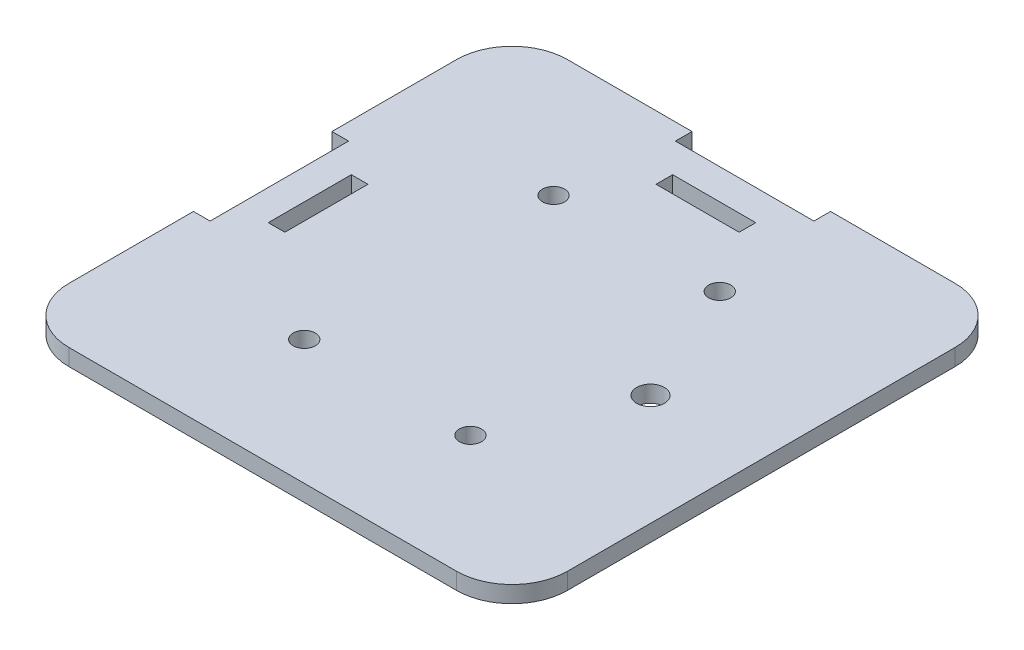
ISO-10303-21;
HEADER;
FILE_DESCRIPTION(('STEP AP214'),'2;1');
FILE_NAME('part.step','',(''),(''),'','','');
FILE_SCHEMA(('AUTOMOTIVE_DESIGN { 1 0 10303 214 1 1 1 1 }'));
ENDSEC;
DATA;
#1=APPLICATION_CONTEXT('core data for automotive mechanical design processes');
#2=APPLICATION_PROTOCOL_DEFINITION('international standard','automotive_design',2000,#1);
#3=PRODUCT_CONTEXT('',#1,'mechanical');
#4=PRODUCT('Part','Part','',(#3));
#5=PRODUCT_RELATED_PRODUCT_CATEGORY('part','',(#4));
#6=PRODUCT_DEFINITION_FORMATION('','',#4);
#7=PRODUCT_DEFINITION_CONTEXT('part definition',#1,'design');
#8=PRODUCT_DEFINITION('design','',#6,#7);
#9=PRODUCT_DEFINITION_SHAPE('','',#8);
#10=(LENGTH_UNIT() NAMED_UNIT(*) SI_UNIT(.MILLI.,.METRE.));
#11=(NAMED_UNIT(*) PLANE_ANGLE_UNIT() SI_UNIT($,.RADIAN.));
#12=(NAMED_UNIT(*) SI_UNIT($,.STERADIAN.) SOLID_ANGLE_UNIT());
#13=UNCERTAINTY_MEASURE_WITH_UNIT(LENGTH_MEASURE(1.E-05),#10,'distance_accuracy_value','');
#14=(GEOMETRIC_REPRESENTATION_CONTEXT(3) GLOBAL_UNCERTAINTY_ASSIGNED_CONTEXT((#13)) GLOBAL_UNIT_ASSIGNED_CONTEXT((#10,
#11,#12)) REPRESENTATION_CONTEXT('',''));
#15=CARTESIAN_POINT('',(0.,0.,0.));
#16=DIRECTION('',(0.,0.,1.));
#17=DIRECTION('',(1.,0.,0.));
#18=AXIS2_PLACEMENT_3D('',#15,#16,#17);
#19=CARTESIAN_POINT('',(-35.,3.,-35.));
#20=DIRECTION('',(0.,-1.,0.));
#21=DIRECTION('',(0.,0.,-1.));
#22=AXIS2_PLACEMENT_3D('',#19,#20,#21);
#23=CYLINDRICAL_SURFACE('',#22,10.);
#24=CARTESIAN_POINT('',(-35.,0.,-35.));
#25=DIRECTION('',(0.,1.,0.));
#26=DIRECTION('',(0.,0.,1.));
#27=AXIS2_PLACEMENT_3D('',#24,#25,#26);
#28=CIRCLE('',#27,10.);
#29=CARTESIAN_POINT('',(-45.,0.,-35.));
#30=VERTEX_POINT('',#29);
#31=CARTESIAN_POINT('',(-35.,0.,-45.));
#32=VERTEX_POINT('',#31);
#33=EDGE_CURVE('E268',#30,#32,#28,.F.);
#34=ORIENTED_EDGE('',*,*,#33,.F.);
#35=DIRECTION('',(0.,-1.,0.));
#36=VECTOR('',#35,1.);
#37=CARTESIAN_POINT('',(-45.,3.,-35.));
#38=LINE('',#37,#36);
#39=CARTESIAN_POINT('',(-45.,3.,-35.));
#40=VERTEX_POINT('',#39);
#41=EDGE_CURVE('E380',#40,#30,#38,.T.);
#42=ORIENTED_EDGE('',*,*,#41,.F.);
#43=CARTESIAN_POINT('',(-35.,3.,-35.));
#44=DIRECTION('',(0.,1.,0.));
#45=DIRECTION('',(0.,0.,1.));
#46=AXIS2_PLACEMENT_3D('',#43,#44,#45);
#47=CIRCLE('',#46,10.);
#48=CARTESIAN_POINT('',(-35.,3.,-45.));
#49=VERTEX_POINT('',#48);
#50=EDGE_CURVE('E271',#40,#49,#47,.F.);
#51=ORIENTED_EDGE('',*,*,#50,.T.);
#52=DIRECTION('',(0.,-1.,0.));
#53=VECTOR('',#52,1.);
#54=CARTESIAN_POINT('',(-35.,3.,-45.));
#55=LINE('',#54,#53);
#56=EDGE_CURVE('E345',#49,#32,#55,.T.);
#57=ORIENTED_EDGE('',*,*,#56,.T.);
#58=EDGE_LOOP('',(#34,#42,#51,#57));
#59=FACE_BOUND('',#58,.T.);
#60=ADVANCED_FACE('F34',(#59),#23,.T.);
#61=CARTESIAN_POINT('',(-45.,3.,0.));
#62=DIRECTION('',(-1.,0.,0.));
#63=DIRECTION('',(0.,0.,1.));
#64=AXIS2_PLACEMENT_3D('',#61,#62,#63);
#65=PLANE('',#64);
#66=DIRECTION('',(0.,0.,-1.));
#67=VECTOR('',#66,1.);
#68=CARTESIAN_POINT('',(-45.,0.,0.));
#69=LINE('',#68,#67);
#70=CARTESIAN_POINT('',(-45.,0.,-12.5));
#71=VERTEX_POINT('',#70);
#72=EDGE_CURVE('E310',#71,#30,#69,.T.);
#73=ORIENTED_EDGE('',*,*,#72,.F.);
#74=DIRECTION('',(0.,-1.,0.));
#75=VECTOR('',#74,1.);
#76=CARTESIAN_POINT('',(-45.,3.,-12.5));
#77=LINE('',#76,#75);
#78=CARTESIAN_POINT('',(-45.,3.,-12.5));
#79=VERTEX_POINT('',#78);
#80=EDGE_CURVE('E378',#79,#71,#77,.T.);
#81=ORIENTED_EDGE('',*,*,#80,.F.);
#82=DIRECTION('',(0.,0.,-1.));
#83=VECTOR('',#82,1.);
#84=CARTESIAN_POINT('',(-45.,3.,0.));
#85=LINE('',#84,#83);
#86=EDGE_CURVE('E274',#79,#40,#85,.T.);
#87=ORIENTED_EDGE('',*,*,#86,.T.);
#88=ORIENTED_EDGE('',*,*,#41,.T.);
#89=EDGE_LOOP('',(#73,#81,#87,#88));
#90=FACE_BOUND('',#89,.T.);
#91=ADVANCED_FACE('F419',(#90),#65,.T.);
#92=CARTESIAN_POINT('',(0.,3.,-12.5));
#93=DIRECTION('',(0.,0.,-1.));
#94=DIRECTION('',(-1.,0.,0.));
#95=AXIS2_PLACEMENT_3D('',#92,#93,#94);
#96=PLANE('',#95);
#97=DIRECTION('',(1.,0.,0.));
#98=VECTOR('',#97,1.);
#99=CARTESIAN_POINT('',(0.,0.,-12.5));
#100=LINE('',#99,#98);
#101=CARTESIAN_POINT('',(-42.,0.,-12.5));
#102=VERTEX_POINT('',#101);
#103=EDGE_CURVE('E313',#71,#102,#100,.T.);
#104=ORIENTED_EDGE('',*,*,#103,.T.);
#105=DIRECTION('',(0.,-1.,0.));
#106=VECTOR('',#105,1.);
#107=CARTESIAN_POINT('',(-42.,3.,-12.5));
#108=LINE('',#107,#106);
#109=CARTESIAN_POINT('',(-42.,3.,-12.5));
#110=VERTEX_POINT('',#109);
#111=EDGE_CURVE('E375',#110,#102,#108,.T.);
#112=ORIENTED_EDGE('',*,*,#111,.F.);
#113=DIRECTION('',(1.,0.,0.));
#114=VECTOR('',#113,1.);
#115=CARTESIAN_POINT('',(0.,3.,-12.5));
#116=LINE('',#115,#114);
#117=EDGE_CURVE('E278',#79,#110,#116,.T.);
#118=ORIENTED_EDGE('',*,*,#117,.F.);
#119=ORIENTED_EDGE('',*,*,#80,.T.);
#120=EDGE_LOOP('',(#104,#112,#118,#119));
#121=FACE_BOUND('',#120,.T.);
#122=ADVANCED_FACE('F424',(#121),#96,.F.);
#123=CARTESIAN_POINT('',(-42.,3.,0.));
#124=DIRECTION('',(1.,0.,0.));
#125=DIRECTION('',(0.,0.,-1.));
#126=AXIS2_PLACEMENT_3D('',#123,#124,#125);
#127=PLANE('',#126);
#128=DIRECTION('',(0.,0.,1.));
#129=VECTOR('',#128,1.);
#130=CARTESIAN_POINT('',(-42.,0.,0.));
#131=LINE('',#130,#129);
#132=CARTESIAN_POINT('',(-42.,0.,12.5));
#133=VERTEX_POINT('',#132);
#134=EDGE_CURVE('E316',#102,#133,#131,.T.);
#135=ORIENTED_EDGE('',*,*,#134,.T.);
#136=DIRECTION('',(0.,-1.,0.));
#137=VECTOR('',#136,1.);
#138=CARTESIAN_POINT('',(-42.,3.,12.5));
#139=LINE('',#138,#137);
#140=CARTESIAN_POINT('',(-42.,3.,12.5));
#141=VERTEX_POINT('',#140);
#142=EDGE_CURVE('E373',#141,#133,#139,.T.);
#143=ORIENTED_EDGE('',*,*,#142,.F.);
#144=DIRECTION('',(0.,0.,1.));
#145=VECTOR('',#144,1.);
#146=CARTESIAN_POINT('',(-42.,3.,0.));
#147=LINE('',#146,#145);
#148=EDGE_CURVE('E281',#110,#141,#147,.T.);
#149=ORIENTED_EDGE('',*,*,#148,.F.);
#150=ORIENTED_EDGE('',*,*,#111,.T.);
#151=EDGE_LOOP('',(#135,#143,#149,#150));
#152=FACE_BOUND('',#151,.T.);
#153=ADVANCED_FACE('F496',(#152),#127,.F.);
#154=CARTESIAN_POINT('',(0.,3.,12.5));
#155=DIRECTION('',(0.,0.,-1.));
#156=DIRECTION('',(-1.,0.,0.));
#157=AXIS2_PLACEMENT_3D('',#154,#155,#156);
#158=PLANE('',#157);
#159=DIRECTION('',(1.,0.,0.));
#160=VECTOR('',#159,1.);
#161=CARTESIAN_POINT('',(0.,0.,12.5));
#162=LINE('',#161,#160);
#163=CARTESIAN_POINT('',(-45.,0.,12.5));
#164=VERTEX_POINT('',#163);
#165=EDGE_CURVE('E319',#164,#133,#162,.T.);
#166=ORIENTED_EDGE('',*,*,#165,.F.);
#167=DIRECTION('',(0.,-1.,0.));
#168=VECTOR('',#167,1.);
#169=CARTESIAN_POINT('',(-45.,3.,12.5));
#170=LINE('',#169,#168);
#171=CARTESIAN_POINT('',(-45.,3.,12.5));
#172=VERTEX_POINT('',#171);
#173=EDGE_CURVE('E371',#172,#164,#170,.T.);
#174=ORIENTED_EDGE('',*,*,#173,.F.);
#175=DIRECTION('',(1.,0.,0.));
#176=VECTOR('',#175,1.);
#177=CARTESIAN_POINT('',(0.,3.,12.5));
#178=LINE('',#177,#176);
#179=EDGE_CURVE('E283',#172,#141,#178,.T.);
#180=ORIENTED_EDGE('',*,*,#179,.T.);
#181=ORIENTED_EDGE('',*,*,#142,.T.);
#182=EDGE_LOOP('',(#166,#174,#180,#181));
#183=FACE_BOUND('',#182,.T.);
#184=ADVANCED_FACE('F493',(#183),#158,.T.);
#185=CARTESIAN_POINT('',(-45.,0.,35.));
#186=VERTEX_POINT('',#185);
#187=EDGE_CURVE('E314',#186,#164,#69,.T.);
#188=ORIENTED_EDGE('',*,*,#187,.F.);
#189=DIRECTION('',(0.,-1.,0.));
#190=VECTOR('',#189,1.);
#191=CARTESIAN_POINT('',(-45.,3.,35.));
#192=LINE('',#191,#190);
#193=CARTESIAN_POINT('',(-45.,3.,35.));
#194=VERTEX_POINT('',#193);
#195=EDGE_CURVE('E369',#194,#186,#192,.T.);
#196=ORIENTED_EDGE('',*,*,#195,.F.);
#197=EDGE_CURVE('E279',#194,#172,#85,.T.);
#198=ORIENTED_EDGE('',*,*,#197,.T.);
#199=ORIENTED_EDGE('',*,*,#173,.T.);
#200=EDGE_LOOP('',(#188,#196,#198,#199));
#201=FACE_BOUND('',#200,.T.);
#202=ADVANCED_FACE('F427',(#201),#65,.T.);
#203=CARTESIAN_POINT('',(-35.,3.,35.));
#204=DIRECTION('',(0.,-1.,0.));
#205=DIRECTION('',(0.,0.,-1.));
#206=AXIS2_PLACEMENT_3D('',#203,#204,#205);
#207=CYLINDRICAL_SURFACE('',#206,10.);
#208=CARTESIAN_POINT('',(-35.,0.,35.));
#209=DIRECTION('',(0.,1.,0.));
#210=DIRECTION('',(0.,0.,1.));
#211=AXIS2_PLACEMENT_3D('',#208,#209,#210);
#212=CIRCLE('',#211,10.);
#213=CARTESIAN_POINT('',(-35.,0.,45.));
#214=VERTEX_POINT('',#213);
#215=EDGE_CURVE('E322',#186,#214,#212,.T.);
#216=ORIENTED_EDGE('',*,*,#215,.T.);
#217=DIRECTION('',(0.,-1.,0.));
#218=VECTOR('',#217,1.);
#219=CARTESIAN_POINT('',(-35.,3.,45.));
#220=LINE('',#219,#218);
#221=CARTESIAN_POINT('',(-35.,3.,45.));
#222=VERTEX_POINT('',#221);
#223=EDGE_CURVE('E367',#222,#214,#220,.T.);
#224=ORIENTED_EDGE('',*,*,#223,.F.);
#225=CARTESIAN_POINT('',(-35.,3.,35.));
#226=DIRECTION('',(0.,1.,0.));
#227=DIRECTION('',(0.,0.,1.));
#228=AXIS2_PLACEMENT_3D('',#225,#226,#227);
#229=CIRCLE('',#228,10.);
#230=EDGE_CURVE('E286',#194,#222,#229,.T.);
#231=ORIENTED_EDGE('',*,*,#230,.F.);
#232=ORIENTED_EDGE('',*,*,#195,.T.);
#233=EDGE_LOOP('',(#216,#224,#231,#232));
#234=FACE_BOUND('',#233,.T.);
#235=ADVANCED_FACE('F508',(#234),#207,.T.);
#236=CARTESIAN_POINT('',(0.,3.,45.));
#237=DIRECTION('',(0.,0.,1.));
#238=DIRECTION('',(1.,0.,0.));
#239=AXIS2_PLACEMENT_3D('',#236,#237,#238);
#240=PLANE('',#239);
#241=DIRECTION('',(-1.,0.,0.));
#242=VECTOR('',#241,1.);
#243=CARTESIAN_POINT('',(0.,0.,45.));
#244=LINE('',#243,#242);
#245=CARTESIAN_POINT('',(35.,0.,45.));
#246=VERTEX_POINT('',#245);
#247=EDGE_CURVE('E325',#246,#214,#244,.T.);
#248=ORIENTED_EDGE('',*,*,#247,.F.);
#249=DIRECTION('',(0.,-1.,0.));
#250=VECTOR('',#249,1.);
#251=CARTESIAN_POINT('',(35.,3.,45.));
#252=LINE('',#251,#250);
#253=CARTESIAN_POINT('',(35.,3.,45.));
#254=VERTEX_POINT('',#253);
#255=EDGE_CURVE('E365',#254,#246,#252,.T.);
#256=ORIENTED_EDGE('',*,*,#255,.F.);
#257=DIRECTION('',(-1.,0.,0.));
#258=VECTOR('',#257,1.);
#259=CARTESIAN_POINT('',(0.,3.,45.));
#260=LINE('',#259,#258);
#261=EDGE_CURVE('E288',#254,#222,#260,.T.);
#262=ORIENTED_EDGE('',*,*,#261,.T.);
#263=ORIENTED_EDGE('',*,*,#223,.T.);
#264=EDGE_LOOP('',(#248,#256,#262,#263));
#265=FACE_BOUND('',#264,.T.);
#266=ADVANCED_FACE('F480',(#265),#240,.T.);
#267=CARTESIAN_POINT('',(35.,3.,35.));
#268=DIRECTION('',(0.,-1.,0.));
#269=DIRECTION('',(0.,0.,-1.));
#270=AXIS2_PLACEMENT_3D('',#267,#268,#269);
#271=CYLINDRICAL_SURFACE('',#270,10.);
#272=CARTESIAN_POINT('',(35.,0.,35.));
#273=DIRECTION('',(0.,1.,0.));
#274=DIRECTION('',(0.,0.,1.));
#275=AXIS2_PLACEMENT_3D('',#272,#273,#274);
#276=CIRCLE('',#275,10.);
#277=CARTESIAN_POINT('',(45.,0.,35.));
#278=VERTEX_POINT('',#277);
#279=EDGE_CURVE('E328',#246,#278,#276,.T.);
#280=ORIENTED_EDGE('',*,*,#279,.T.);
#281=DIRECTION('',(0.,-1.,0.));
#282=VECTOR('',#281,1.);
#283=CARTESIAN_POINT('',(45.,3.,35.));
#284=LINE('',#283,#282);
#285=CARTESIAN_POINT('',(45.,3.,35.));
#286=VERTEX_POINT('',#285);
#287=EDGE_CURVE('E362',#286,#278,#284,.T.);
#288=ORIENTED_EDGE('',*,*,#287,.F.);
#289=CARTESIAN_POINT('',(35.,3.,35.));
#290=DIRECTION('',(0.,1.,0.));
#291=DIRECTION('',(0.,0.,1.));
#292=AXIS2_PLACEMENT_3D('',#289,#290,#291);
#293=CIRCLE('',#292,10.);
#294=EDGE_CURVE('E291',#254,#286,#293,.T.);
#295=ORIENTED_EDGE('',*,*,#294,.F.);
#296=ORIENTED_EDGE('',*,*,#255,.T.);
#297=EDGE_LOOP('',(#280,#288,#295,#296));
#298=FACE_BOUND('',#297,.T.);
#299=ADVANCED_FACE('F477',(#298),#271,.T.);
#300=CARTESIAN_POINT('',(45.,3.,0.));
#301=DIRECTION('',(-1.,0.,0.));
#302=DIRECTION('',(0.,0.,1.));
#303=AXIS2_PLACEMENT_3D('',#300,#301,#302);
#304=PLANE('',#303);
#305=DIRECTION('',(0.,0.,-1.));
#306=VECTOR('',#305,1.);
#307=CARTESIAN_POINT('',(45.,0.,0.));
#308=LINE('',#307,#306);
#309=CARTESIAN_POINT('',(45.,0.,-35.));
#310=VERTEX_POINT('',#309);
#311=EDGE_CURVE('E330',#278,#310,#308,.T.);
#312=ORIENTED_EDGE('',*,*,#311,.T.);
#313=DIRECTION('',(0.,-1.,0.));
#314=VECTOR('',#313,1.);
#315=CARTESIAN_POINT('',(45.,3.,-35.));
#316=LINE('',#315,#314);
#317=CARTESIAN_POINT('',(45.,3.,-35.));
#318=VERTEX_POINT('',#317);
#319=EDGE_CURVE('E359',#318,#310,#316,.T.);
#320=ORIENTED_EDGE('',*,*,#319,.F.);
#321=DIRECTION('',(0.,0.,-1.));
#322=VECTOR('',#321,1.);
#323=CARTESIAN_POINT('',(45.,3.,0.));
#324=LINE('',#323,#322);
#325=EDGE_CURVE('E293',#286,#318,#324,.T.);
#326=ORIENTED_EDGE('',*,*,#325,.F.);
#327=ORIENTED_EDGE('',*,*,#287,.T.);
#328=EDGE_LOOP('',(#312,#320,#326,#327));
#329=FACE_BOUND('',#328,.T.);
#330=ADVANCED_FACE('F472',(#329),#304,.F.);
#331=CARTESIAN_POINT('',(35.,3.,-35.));
#332=DIRECTION('',(0.,-1.,0.));
#333=DIRECTION('',(0.,0.,-1.));
#334=AXIS2_PLACEMENT_3D('',#331,#332,#333);
#335=CYLINDRICAL_SURFACE('',#334,10.);
#336=CARTESIAN_POINT('',(35.,0.,-35.));
#337=DIRECTION('',(0.,1.,0.));
#338=DIRECTION('',(0.,0.,1.));
#339=AXIS2_PLACEMENT_3D('',#336,#337,#338);
#340=CIRCLE('',#339,10.);
#341=CARTESIAN_POINT('',(35.,0.,-45.));
#342=VERTEX_POINT('',#341);
#343=EDGE_CURVE('E332',#310,#342,#340,.T.);
#344=ORIENTED_EDGE('',*,*,#343,.T.);
#345=DIRECTION('',(0.,-1.,0.));
#346=VECTOR('',#345,1.);
#347=CARTESIAN_POINT('',(35.,3.,-45.));
#348=LINE('',#347,#346);
#349=CARTESIAN_POINT('',(35.,3.,-45.));
#350=VERTEX_POINT('',#349);
#351=EDGE_CURVE('E356',#350,#342,#348,.T.);
#352=ORIENTED_EDGE('',*,*,#351,.F.);
#353=CARTESIAN_POINT('',(35.,3.,-35.));
#354=DIRECTION('',(0.,1.,0.));
#355=DIRECTION('',(0.,0.,1.));
#356=AXIS2_PLACEMENT_3D('',#353,#354,#355);
#357=CIRCLE('',#356,10.);
#358=EDGE_CURVE('E295',#318,#350,#357,.T.);
#359=ORIENTED_EDGE('',*,*,#358,.F.);
#360=ORIENTED_EDGE('',*,*,#319,.T.);
#361=EDGE_LOOP('',(#344,#352,#359,#360));
#362=FACE_BOUND('',#361,.T.);
#363=ADVANCED_FACE('F466',(#362),#335,.T.);
#364=CARTESIAN_POINT('',(0.,3.,-45.));
#365=DIRECTION('',(0.,0.,1.));
#366=DIRECTION('',(1.,0.,0.));
#367=AXIS2_PLACEMENT_3D('',#364,#365,#366);
#368=PLANE('',#367);
#369=DIRECTION('',(-1.,0.,0.));
#370=VECTOR('',#369,1.);
#371=CARTESIAN_POINT('',(0.,0.,-45.));
#372=LINE('',#371,#370);
#373=CARTESIAN_POINT('',(12.5,0.,-45.));
#374=VERTEX_POINT('',#373);
#375=EDGE_CURVE('E334',#342,#374,#372,.T.);
#376=ORIENTED_EDGE('',*,*,#375,.T.);
#377=DIRECTION('',(0.,-1.,0.));
#378=VECTOR('',#377,1.);
#379=CARTESIAN_POINT('',(12.5,3.,-45.));
#380=LINE('',#379,#378);
#381=CARTESIAN_POINT('',(12.5,3.,-45.));
#382=VERTEX_POINT('',#381);
#383=EDGE_CURVE('E353',#382,#374,#380,.T.);
#384=ORIENTED_EDGE('',*,*,#383,.F.);
#385=DIRECTION('',(-1.,0.,0.));
#386=VECTOR('',#385,1.);
#387=CARTESIAN_POINT('',(0.,3.,-45.));
#388=LINE('',#387,#386);
#389=EDGE_CURVE('E297',#350,#382,#388,.T.);
#390=ORIENTED_EDGE('',*,*,#389,.F.);
#391=ORIENTED_EDGE('',*,*,#351,.T.);
#392=EDGE_LOOP('',(#376,#384,#390,#391));
#393=FACE_BOUND('',#392,.T.);
#394=ADVANCED_FACE('F462',(#393),#368,.F.);
#395=CARTESIAN_POINT('',(12.5,3.,0.));
#396=DIRECTION('',(1.,0.,0.));
#397=DIRECTION('',(0.,0.,-1.));
#398=AXIS2_PLACEMENT_3D('',#395,#396,#397);
#399=PLANE('',#398);
#400=DIRECTION('',(0.,0.,1.));
#401=VECTOR('',#400,1.);
#402=CARTESIAN_POINT('',(12.5,0.,0.));
#403=LINE('',#402,#401);
#404=CARTESIAN_POINT('',(12.5,0.,-42.));
#405=VERTEX_POINT('',#404);
#406=EDGE_CURVE('E336',#374,#405,#403,.T.);
#407=ORIENTED_EDGE('',*,*,#406,.T.);
#408=DIRECTION('',(0.,-1.,0.));
#409=VECTOR('',#408,1.);
#410=CARTESIAN_POINT('',(12.5,3.,-42.));
#411=LINE('',#410,#409);
#412=CARTESIAN_POINT('',(12.5,3.,-42.));
#413=VERTEX_POINT('',#412);
#414=EDGE_CURVE('E351',#413,#405,#411,.T.);
#415=ORIENTED_EDGE('',*,*,#414,.F.);
#416=DIRECTION('',(0.,0.,1.));
#417=VECTOR('',#416,1.);
#418=CARTESIAN_POINT('',(12.5,3.,0.));
#419=LINE('',#418,#417);
#420=EDGE_CURVE('E299',#382,#413,#419,.T.);
#421=ORIENTED_EDGE('',*,*,#420,.F.);
#422=ORIENTED_EDGE('',*,*,#383,.T.);
#423=EDGE_LOOP('',(#407,#415,#421,#422));
#424=FACE_BOUND('',#423,.T.);
#425=ADVANCED_FACE('F457',(#424),#399,.F.);
#426=CARTESIAN_POINT('',(0.,3.,-42.));
#427=DIRECTION('',(0.,0.,-1.));
#428=DIRECTION('',(-1.,0.,0.));
#429=AXIS2_PLACEMENT_3D('',#426,#427,#428);
#430=PLANE('',#429);
#431=DIRECTION('',(1.,0.,0.));
#432=VECTOR('',#431,1.);
#433=CARTESIAN_POINT('',(0.,0.,-42.));
#434=LINE('',#433,#432);
#435=CARTESIAN_POINT('',(-12.5,0.,-42.));
#436=VERTEX_POINT('',#435);
#437=EDGE_CURVE('E339',#436,#405,#434,.T.);
#438=ORIENTED_EDGE('',*,*,#437,.F.);
#439=DIRECTION('',(0.,-1.,0.));
#440=VECTOR('',#439,1.);
#441=CARTESIAN_POINT('',(-12.5,3.,-42.));
#442=LINE('',#441,#440);
#443=CARTESIAN_POINT('',(-12.5,3.,-42.));
#444=VERTEX_POINT('',#443);
#445=EDGE_CURVE('E349',#444,#436,#442,.T.);
#446=ORIENTED_EDGE('',*,*,#445,.F.);
#447=DIRECTION('',(1.,0.,0.));
#448=VECTOR('',#447,1.);
#449=CARTESIAN_POINT('',(0.,3.,-42.));
#450=LINE('',#449,#448);
#451=EDGE_CURVE('E302',#444,#413,#450,.T.);
#452=ORIENTED_EDGE('',*,*,#451,.T.);
#453=ORIENTED_EDGE('',*,*,#414,.T.);
#454=EDGE_LOOP('',(#438,#446,#452,#453));
#455=FACE_BOUND('',#454,.T.);
#456=ADVANCED_FACE('F451',(#455),#430,.T.);
#457=CARTESIAN_POINT('',(-12.5,3.,0.));
#458=DIRECTION('',(1.,0.,0.));
#459=DIRECTION('',(0.,0.,-1.));
#460=AXIS2_PLACEMENT_3D('',#457,#458,#459);
#461=PLANE('',#460);
#462=DIRECTION('',(0.,0.,1.));
#463=VECTOR('',#462,1.);
#464=CARTESIAN_POINT('',(-12.5,0.,0.));
#465=LINE('',#464,#463);
#466=CARTESIAN_POINT('',(-12.5,0.,-45.));
#467=VERTEX_POINT('',#466);
#468=EDGE_CURVE('E342',#467,#436,#465,.T.);
#469=ORIENTED_EDGE('',*,*,#468,.F.);
#470=DIRECTION('',(0.,-1.,0.));
#471=VECTOR('',#470,1.);
#472=CARTESIAN_POINT('',(-12.5,3.,-45.));
#473=LINE('',#472,#471);
#474=CARTESIAN_POINT('',(-12.5,3.,-45.));
#475=VERTEX_POINT('',#474);
#476=EDGE_CURVE('E347',#475,#467,#473,.T.);
#477=ORIENTED_EDGE('',*,*,#476,.F.);
#478=DIRECTION('',(0.,0.,1.));
#479=VECTOR('',#478,1.);
#480=CARTESIAN_POINT('',(-12.5,3.,0.));
#481=LINE('',#480,#479);
#482=EDGE_CURVE('E305',#475,#444,#481,.T.);
#483=ORIENTED_EDGE('',*,*,#482,.T.);
#484=ORIENTED_EDGE('',*,*,#445,.T.);
#485=EDGE_LOOP('',(#469,#477,#483,#484));
#486=FACE_BOUND('',#485,.T.);
#487=ADVANCED_FACE('F448',(#486),#461,.T.);
#488=EDGE_CURVE('E275',#467,#32,#372,.T.);
#489=ORIENTED_EDGE('',*,*,#488,.T.);
#490=ORIENTED_EDGE('',*,*,#56,.F.);
#491=EDGE_CURVE('E300',#475,#49,#388,.T.);
#492=ORIENTED_EDGE('',*,*,#491,.F.);
#493=ORIENTED_EDGE('',*,*,#476,.T.);
#494=EDGE_LOOP('',(#489,#490,#492,#493));
#495=FACE_BOUND('',#494,.T.);
#496=ADVANCED_FACE('F445',(#495),#368,.F.);
#497=CARTESIAN_POINT('',(0.,3.,0.));
#498=DIRECTION('',(0.,1.,0.));
#499=DIRECTION('',(0.,0.,1.));
#500=AXIS2_PLACEMENT_3D('',#497,#498,#499);
#501=PLANE('',#500);
#502=CARTESIAN_POINT('',(25.,3.,-1.01467489374629E-13));
#503=DIRECTION('',(0.,1.,0.));
#504=DIRECTION('',(0.,0.,1.));
#505=AXIS2_PLACEMENT_3D('',#502,#503,#504);
#506=CIRCLE('',#505,2.5);
#507=CARTESIAN_POINT('',(25.,3.,2.4999999999999));
#508=VERTEX_POINT('',#507);
#509=EDGE_CURVE('E651',#508,#508,#506,.T.);
#510=ORIENTED_EDGE('',*,*,#509,.F.);
#511=EDGE_LOOP('',(#510));
#512=FACE_BOUND('',#511,.T.);
#513=DIRECTION('',(0.,0.,1.));
#514=VECTOR('',#513,1.);
#515=CARTESIAN_POINT('',(-7.49999999999999,3.,-33.5));
#516=LINE('',#515,#514);
#517=CARTESIAN_POINT('',(-7.49999999999999,3.,-36.5));
#518=VERTEX_POINT('',#517);
#519=CARTESIAN_POINT('',(-7.49999999999999,3.,-33.5));
#520=VERTEX_POINT('',#519);
#521=EDGE_CURVE('E49',#518,#520,#516,.T.);
#522=ORIENTED_EDGE('',*,*,#521,.F.);
#523=DIRECTION('',(-1.,0.,0.));
#524=VECTOR('',#523,1.);
#525=CARTESIAN_POINT('',(7.50000000000001,3.,-36.5));
#526=LINE('',#525,#524);
#527=CARTESIAN_POINT('',(7.50000000000001,3.,-36.5));
#528=VERTEX_POINT('',#527);
#529=EDGE_CURVE('E219',#528,#518,#526,.T.);
#530=ORIENTED_EDGE('',*,*,#529,.F.);
#531=DIRECTION('',(0.,0.,-1.));
#532=VECTOR('',#531,1.);
#533=CARTESIAN_POINT('',(7.50000000000001,3.,-33.5));
#534=LINE('',#533,#532);
#535=CARTESIAN_POINT('',(7.50000000000001,3.,-33.5));
#536=VERTEX_POINT('',#535);
#537=EDGE_CURVE('E202',#536,#528,#534,.T.);
#538=ORIENTED_EDGE('',*,*,#537,.F.);
#539=DIRECTION('',(1.,0.,0.));
#540=VECTOR('',#539,1.);
#541=CARTESIAN_POINT('',(7.50000000000001,3.,-33.5));
#542=LINE('',#541,#540);
#543=EDGE_CURVE('E212',#520,#536,#542,.T.);
#544=ORIENTED_EDGE('',*,*,#543,.F.);
#545=EDGE_LOOP('',(#522,#530,#538,#544));
#546=FACE_BOUND('',#545,.T.);
#547=DIRECTION('',(0.,0.,1.));
#548=VECTOR('',#547,1.);
#549=CARTESIAN_POINT('',(-36.5,3.,7.5));
#550=LINE('',#549,#548);
#551=CARTESIAN_POINT('',(-36.5,3.,-7.5));
#552=VERTEX_POINT('',#551);
#553=CARTESIAN_POINT('',(-36.5,3.,7.5));
#554=VERTEX_POINT('',#553);
#555=EDGE_CURVE('E57',#552,#554,#550,.T.);
#556=ORIENTED_EDGE('',*,*,#555,.F.);
#557=DIRECTION('',(-1.,0.,0.));
#558=VECTOR('',#557,1.);
#559=CARTESIAN_POINT('',(-33.5,3.,-7.5));
#560=LINE('',#559,#558);
#561=CARTESIAN_POINT('',(-33.5,3.,-7.5));
#562=VERTEX_POINT('',#561);
#563=EDGE_CURVE('E236',#562,#552,#560,.T.);
#564=ORIENTED_EDGE('',*,*,#563,.F.);
#565=DIRECTION('',(0.,0.,-1.));
#566=VECTOR('',#565,1.);
#567=CARTESIAN_POINT('',(-33.5,3.,7.5));
#568=LINE('',#567,#566);
#569=CARTESIAN_POINT('',(-33.5,3.,7.5));
#570=VERTEX_POINT('',#569);
#571=EDGE_CURVE('E233',#570,#562,#568,.T.);
#572=ORIENTED_EDGE('',*,*,#571,.F.);
#573=DIRECTION('',(1.,0.,0.));
#574=VECTOR('',#573,1.);
#575=CARTESIAN_POINT('',(-33.5,3.,7.5));
#576=LINE('',#575,#574);
#577=EDGE_CURVE('E230',#554,#570,#576,.T.);
#578=ORIENTED_EDGE('',*,*,#577,.F.);
#579=EDGE_LOOP('',(#556,#564,#572,#578));
#580=FACE_BOUND('',#579,.T.);
#581=CARTESIAN_POINT('',(-15.,3.,22.5));
#582=DIRECTION('',(0.,1.,0.));
#583=DIRECTION('',(0.,0.,-1.));
#584=AXIS2_PLACEMENT_3D('',#581,#582,#583);
#585=CIRCLE('',#584,2.);
#586=CARTESIAN_POINT('',(-15.,3.,20.5));
#587=VERTEX_POINT('',#586);
#588=EDGE_CURVE('E226',#587,#587,#585,.T.);
#589=ORIENTED_EDGE('',*,*,#588,.F.);
#590=EDGE_LOOP('',(#589));
#591=FACE_BOUND('',#590,.T.);
#592=CARTESIAN_POINT('',(15.,3.,22.5));
#593=DIRECTION('',(0.,1.,0.));
#594=DIRECTION('',(0.,0.,1.));
#595=AXIS2_PLACEMENT_3D('',#592,#593,#594);
#596=CIRCLE('',#595,2.00000000000001);
#597=CARTESIAN_POINT('',(15.,3.,24.5));
#598=VERTEX_POINT('',#597);
#599=EDGE_CURVE('E257',#598,#598,#596,.T.);
#600=ORIENTED_EDGE('',*,*,#599,.F.);
#601=EDGE_LOOP('',(#600));
#602=FACE_BOUND('',#601,.T.);
#603=CARTESIAN_POINT('',(15.,3.,-22.5));
#604=DIRECTION('',(0.,1.,0.));
#605=DIRECTION('',(0.,0.,-1.));
#606=AXIS2_PLACEMENT_3D('',#603,#604,#605);
#607=CIRCLE('',#606,2.00000000000001);
#608=CARTESIAN_POINT('',(15.,3.,-24.5));
#609=VERTEX_POINT('',#608);
#610=EDGE_CURVE('E251',#609,#609,#607,.T.);
#611=ORIENTED_EDGE('',*,*,#610,.F.);
#612=EDGE_LOOP('',(#611));
#613=FACE_BOUND('',#612,.T.);
#614=CARTESIAN_POINT('',(-15.,3.,-22.5));
#615=DIRECTION('',(0.,1.,0.));
#616=DIRECTION('',(0.,0.,1.));
#617=AXIS2_PLACEMENT_3D('',#614,#615,#616);
#618=CIRCLE('',#617,2.);
#619=CARTESIAN_POINT('',(-15.,3.,-20.5));
#620=VERTEX_POINT('',#619);
#621=EDGE_CURVE('E250',#620,#620,#618,.T.);
#622=ORIENTED_EDGE('',*,*,#621,.F.);
#623=EDGE_LOOP('',(#622));
#624=FACE_BOUND('',#623,.T.);
#625=ORIENTED_EDGE('',*,*,#50,.F.);
#626=ORIENTED_EDGE('',*,*,#86,.F.);
#627=ORIENTED_EDGE('',*,*,#117,.T.);
#628=ORIENTED_EDGE('',*,*,#148,.T.);
#629=ORIENTED_EDGE('',*,*,#179,.F.);
#630=ORIENTED_EDGE('',*,*,#197,.F.);
#631=ORIENTED_EDGE('',*,*,#230,.T.);
#632=ORIENTED_EDGE('',*,*,#261,.F.);
#633=ORIENTED_EDGE('',*,*,#294,.T.);
#634=ORIENTED_EDGE('',*,*,#325,.T.);
#635=ORIENTED_EDGE('',*,*,#358,.T.);
#636=ORIENTED_EDGE('',*,*,#389,.T.);
#637=ORIENTED_EDGE('',*,*,#420,.T.);
#638=ORIENTED_EDGE('',*,*,#451,.F.);
#639=ORIENTED_EDGE('',*,*,#482,.F.);
#640=ORIENTED_EDGE('',*,*,#491,.T.);
#641=EDGE_LOOP('',(#625,#626,#627,#628,#629,#630,#631,#632,#633,#634,#635,#636,#637,#638,#639,#640));
#642=FACE_BOUND('',#641,.T.);
#643=ADVANCED_FACE('F216',(#512,#546,#580,#591,#602,#613,#624,#642),#501,.T.);
#644=CARTESIAN_POINT('',(0.,0.,0.));
#645=DIRECTION('',(0.,1.,0.));
#646=DIRECTION('',(0.,0.,1.));
#647=AXIS2_PLACEMENT_3D('',#644,#645,#646);
#648=PLANE('',#647);
#649=CARTESIAN_POINT('',(25.,0.,-1.01467489374629E-13));
#650=DIRECTION('',(0.,1.,0.));
#651=DIRECTION('',(0.,0.,1.));
#652=AXIS2_PLACEMENT_3D('',#649,#650,#651);
#653=CIRCLE('',#652,2.5);
#654=CARTESIAN_POINT('',(25.,0.,2.4999999999999));
#655=VERTEX_POINT('',#654);
#656=EDGE_CURVE('E37',#655,#655,#653,.T.);
#657=ORIENTED_EDGE('',*,*,#656,.T.);
#658=EDGE_LOOP('',(#657));
#659=FACE_BOUND('',#658,.T.);
#660=DIRECTION('',(-1.,0.,0.));
#661=VECTOR('',#660,1.);
#662=CARTESIAN_POINT('',(0.,0.,-36.5));
#663=LINE('',#662,#661);
#664=CARTESIAN_POINT('',(7.50000000000001,0.,-36.5));
#665=VERTEX_POINT('',#664);
#666=CARTESIAN_POINT('',(-7.49999999999999,0.,-36.5));
#667=VERTEX_POINT('',#666);
#668=EDGE_CURVE('E42',#665,#667,#663,.T.);
#669=ORIENTED_EDGE('',*,*,#668,.T.);
#670=DIRECTION('',(0.,0.,1.));
#671=VECTOR('',#670,1.);
#672=CARTESIAN_POINT('',(-7.5,0.,0.));
#673=LINE('',#672,#671);
#674=CARTESIAN_POINT('',(-7.49999999999999,0.,-33.5));
#675=VERTEX_POINT('',#674);
#676=EDGE_CURVE('E11',#667,#675,#673,.T.);
#677=ORIENTED_EDGE('',*,*,#676,.T.);
#678=DIRECTION('',(1.,0.,0.));
#679=VECTOR('',#678,1.);
#680=CARTESIAN_POINT('',(0.,0.,-33.5));
#681=LINE('',#680,#679);
#682=CARTESIAN_POINT('',(7.50000000000001,0.,-33.5));
#683=VERTEX_POINT('',#682);
#684=EDGE_CURVE('E394',#675,#683,#681,.T.);
#685=ORIENTED_EDGE('',*,*,#684,.T.);
#686=DIRECTION('',(0.,0.,-1.));
#687=VECTOR('',#686,1.);
#688=CARTESIAN_POINT('',(7.50000000000001,0.,0.));
#689=LINE('',#688,#687);
#690=EDGE_CURVE('E205',#683,#665,#689,.T.);
#691=ORIENTED_EDGE('',*,*,#690,.T.);
#692=EDGE_LOOP('',(#669,#677,#685,#691));
#693=FACE_BOUND('',#692,.T.);
#694=DIRECTION('',(-1.,0.,0.));
#695=VECTOR('',#694,1.);
#696=CARTESIAN_POINT('',(0.,0.,-7.5));
#697=LINE('',#696,#695);
#698=CARTESIAN_POINT('',(-33.5,0.,-7.5));
#699=VERTEX_POINT('',#698);
#700=CARTESIAN_POINT('',(-36.5,0.,-7.5));
#701=VERTEX_POINT('',#700);
#702=EDGE_CURVE('E388',#699,#701,#697,.T.);
#703=ORIENTED_EDGE('',*,*,#702,.T.);
#704=DIRECTION('',(0.,0.,1.));
#705=VECTOR('',#704,1.);
#706=CARTESIAN_POINT('',(-36.5,0.,0.));
#707=LINE('',#706,#705);
#708=CARTESIAN_POINT('',(-36.5,0.,7.5));
#709=VERTEX_POINT('',#708);
#710=EDGE_CURVE('E391',#701,#709,#707,.T.);
#711=ORIENTED_EDGE('',*,*,#710,.T.);
#712=DIRECTION('',(1.,0.,0.));
#713=VECTOR('',#712,1.);
#714=CARTESIAN_POINT('',(0.,0.,7.5));
#715=LINE('',#714,#713);
#716=CARTESIAN_POINT('',(-33.5,0.,7.5));
#717=VERTEX_POINT('',#716);
#718=EDGE_CURVE('E382',#709,#717,#715,.T.);
#719=ORIENTED_EDGE('',*,*,#718,.T.);
#720=DIRECTION('',(0.,0.,-1.));
#721=VECTOR('',#720,1.);
#722=CARTESIAN_POINT('',(-33.5,0.,0.));
#723=LINE('',#722,#721);
#724=EDGE_CURVE('E385',#717,#699,#723,.T.);
#725=ORIENTED_EDGE('',*,*,#724,.T.);
#726=EDGE_LOOP('',(#703,#711,#719,#725));
#727=FACE_BOUND('',#726,.T.);
#728=CARTESIAN_POINT('',(-15.,0.,22.5));
#729=DIRECTION('',(0.,1.,0.));
#730=DIRECTION('',(0.,0.,-1.));
#731=AXIS2_PLACEMENT_3D('',#728,#729,#730);
#732=CIRCLE('',#731,2.);
#733=CARTESIAN_POINT('',(-15.,0.,20.5));
#734=VERTEX_POINT('',#733);
#735=EDGE_CURVE('E260',#734,#734,#732,.T.);
#736=ORIENTED_EDGE('',*,*,#735,.T.);
#737=EDGE_LOOP('',(#736));
#738=FACE_BOUND('',#737,.T.);
#739=CARTESIAN_POINT('',(15.,0.,22.5));
#740=DIRECTION('',(0.,1.,0.));
#741=DIRECTION('',(0.,0.,1.));
#742=AXIS2_PLACEMENT_3D('',#739,#740,#741);
#743=CIRCLE('',#742,2.00000000000001);
#744=CARTESIAN_POINT('',(15.,0.,24.5));
#745=VERTEX_POINT('',#744);
#746=EDGE_CURVE('E254',#745,#745,#743,.T.);
#747=ORIENTED_EDGE('',*,*,#746,.T.);
#748=EDGE_LOOP('',(#747));
#749=FACE_BOUND('',#748,.T.);
#750=CARTESIAN_POINT('',(15.,0.,-22.5));
#751=DIRECTION('',(0.,1.,0.));
#752=DIRECTION('',(0.,0.,-1.));
#753=AXIS2_PLACEMENT_3D('',#750,#751,#752);
#754=CIRCLE('',#753,2.00000000000001);
#755=CARTESIAN_POINT('',(15.,0.,-24.5));
#756=VERTEX_POINT('',#755);
#757=EDGE_CURVE('E247',#756,#756,#754,.T.);
#758=ORIENTED_EDGE('',*,*,#757,.T.);
#759=EDGE_LOOP('',(#758));
#760=FACE_BOUND('',#759,.T.);
#761=CARTESIAN_POINT('',(-15.,0.,-22.5));
#762=DIRECTION('',(0.,1.,0.));
#763=DIRECTION('',(0.,0.,1.));
#764=AXIS2_PLACEMENT_3D('',#761,#762,#763);
#765=CIRCLE('',#764,2.);
#766=CARTESIAN_POINT('',(-15.,0.,-20.5));
#767=VERTEX_POINT('',#766);
#768=EDGE_CURVE('E265',#767,#767,#765,.T.);
#769=ORIENTED_EDGE('',*,*,#768,.T.);
#770=EDGE_LOOP('',(#769));
#771=FACE_BOUND('',#770,.T.);
#772=ORIENTED_EDGE('',*,*,#33,.T.);
#773=ORIENTED_EDGE('',*,*,#488,.F.);
#774=ORIENTED_EDGE('',*,*,#468,.T.);
#775=ORIENTED_EDGE('',*,*,#437,.T.);
#776=ORIENTED_EDGE('',*,*,#406,.F.);
#777=ORIENTED_EDGE('',*,*,#375,.F.);
#778=ORIENTED_EDGE('',*,*,#343,.F.);
#779=ORIENTED_EDGE('',*,*,#311,.F.);
#780=ORIENTED_EDGE('',*,*,#279,.F.);
#781=ORIENTED_EDGE('',*,*,#247,.T.);
#782=ORIENTED_EDGE('',*,*,#215,.F.);
#783=ORIENTED_EDGE('',*,*,#187,.T.);
#784=ORIENTED_EDGE('',*,*,#165,.T.);
#785=ORIENTED_EDGE('',*,*,#134,.F.);
#786=ORIENTED_EDGE('',*,*,#103,.F.);
#787=ORIENTED_EDGE('',*,*,#72,.T.);
#788=EDGE_LOOP('',(#772,#773,#774,#775,#776,#777,#778,#779,#780,#781,#782,#783,#784,#785,#786,#787));
#789=FACE_BOUND('',#788,.T.);
#790=ADVANCED_FACE('F399',(#659,#693,#727,#738,#749,#760,#771,#789),#648,.F.);
#791=CARTESIAN_POINT('',(-15.,0.,-22.5));
#792=DIRECTION('',(0.,1.,0.));
#793=DIRECTION('',(0.,0.,1.));
#794=AXIS2_PLACEMENT_3D('',#791,#792,#793);
#795=CYLINDRICAL_SURFACE('',#794,2.);
#796=ORIENTED_EDGE('',*,*,#768,.F.);
#797=EDGE_LOOP('',(#796));
#798=FACE_BOUND('',#797,.T.);
#799=ORIENTED_EDGE('',*,*,#621,.T.);
#800=EDGE_LOOP('',(#799));
#801=FACE_BOUND('',#800,.T.);
#802=ADVANCED_FACE('F529',(#798,#801),#795,.F.);
#803=CARTESIAN_POINT('',(15.,0.,-22.5));
#804=DIRECTION('',(0.,1.,0.));
#805=DIRECTION('',(0.,0.,1.));
#806=AXIS2_PLACEMENT_3D('',#803,#804,#805);
#807=CYLINDRICAL_SURFACE('',#806,2.00000000000001);
#808=ORIENTED_EDGE('',*,*,#757,.F.);
#809=EDGE_LOOP('',(#808));
#810=FACE_BOUND('',#809,.T.);
#811=ORIENTED_EDGE('',*,*,#610,.T.);
#812=EDGE_LOOP('',(#811));
#813=FACE_BOUND('',#812,.T.);
#814=ADVANCED_FACE('F536',(#810,#813),#807,.F.);
#815=CARTESIAN_POINT('',(15.,0.,22.5));
#816=DIRECTION('',(0.,1.,0.));
#817=DIRECTION('',(0.,0.,1.));
#818=AXIS2_PLACEMENT_3D('',#815,#816,#817);
#819=CYLINDRICAL_SURFACE('',#818,2.00000000000001);
#820=ORIENTED_EDGE('',*,*,#746,.F.);
#821=EDGE_LOOP('',(#820));
#822=FACE_BOUND('',#821,.T.);
#823=ORIENTED_EDGE('',*,*,#599,.T.);
#824=EDGE_LOOP('',(#823));
#825=FACE_BOUND('',#824,.T.);
#826=ADVANCED_FACE('F542',(#822,#825),#819,.F.);
#827=CARTESIAN_POINT('',(-15.,0.,22.5));
#828=DIRECTION('',(0.,1.,0.));
#829=DIRECTION('',(0.,0.,1.));
#830=AXIS2_PLACEMENT_3D('',#827,#828,#829);
#831=CYLINDRICAL_SURFACE('',#830,2.);
#832=ORIENTED_EDGE('',*,*,#735,.F.);
#833=EDGE_LOOP('',(#832));
#834=FACE_BOUND('',#833,.T.);
#835=ORIENTED_EDGE('',*,*,#588,.T.);
#836=EDGE_LOOP('',(#835));
#837=FACE_BOUND('',#836,.T.);
#838=ADVANCED_FACE('F538',(#834,#837),#831,.F.);
#839=CARTESIAN_POINT('',(-36.5,-7.,7.5));
#840=DIRECTION('',(-1.,0.,0.));
#841=DIRECTION('',(0.,0.,1.));
#842=AXIS2_PLACEMENT_3D('',#839,#840,#841);
#843=PLANE('',#842);
#844=DIRECTION('',(0.,1.,0.));
#845=VECTOR('',#844,1.);
#846=CARTESIAN_POINT('',(-36.5,-7.,-7.5));
#847=LINE('',#846,#845);
#848=EDGE_CURVE('E240',#701,#552,#847,.T.);
#849=ORIENTED_EDGE('',*,*,#848,.T.);
#850=ORIENTED_EDGE('',*,*,#555,.T.);
#851=DIRECTION('',(0.,1.,0.));
#852=VECTOR('',#851,1.);
#853=CARTESIAN_POINT('',(-36.5,-7.,7.5));
#854=LINE('',#853,#852);
#855=EDGE_CURVE('E239',#709,#554,#854,.T.);
#856=ORIENTED_EDGE('',*,*,#855,.F.);
#857=ORIENTED_EDGE('',*,*,#710,.F.);
#858=EDGE_LOOP('',(#849,#850,#856,#857));
#859=FACE_BOUND('',#858,.T.);
#860=ADVANCED_FACE('F541',(#859),#843,.F.);
#861=CARTESIAN_POINT('',(-33.5,-7.,-7.5));
#862=DIRECTION('',(0.,0.,-1.));
#863=DIRECTION('',(-1.,0.,0.));
#864=AXIS2_PLACEMENT_3D('',#861,#862,#863);
#865=PLANE('',#864);
#866=DIRECTION('',(0.,1.,0.));
#867=VECTOR('',#866,1.);
#868=CARTESIAN_POINT('',(-33.5,-7.,-7.5));
#869=LINE('',#868,#867);
#870=EDGE_CURVE('E242',#699,#562,#869,.T.);
#871=ORIENTED_EDGE('',*,*,#870,.T.);
#872=ORIENTED_EDGE('',*,*,#563,.T.);
#873=ORIENTED_EDGE('',*,*,#848,.F.);
#874=ORIENTED_EDGE('',*,*,#702,.F.);
#875=EDGE_LOOP('',(#871,#872,#873,#874));
#876=FACE_BOUND('',#875,.T.);
#877=ADVANCED_FACE('F551',(#876),#865,.F.);
#878=CARTESIAN_POINT('',(-33.5,-7.,7.5));
#879=DIRECTION('',(1.,0.,0.));
#880=DIRECTION('',(0.,0.,-1.));
#881=AXIS2_PLACEMENT_3D('',#878,#879,#880);
#882=PLANE('',#881);
#883=DIRECTION('',(0.,1.,0.));
#884=VECTOR('',#883,1.);
#885=CARTESIAN_POINT('',(-33.5,-7.,7.5));
#886=LINE('',#885,#884);
#887=EDGE_CURVE('E244',#717,#570,#886,.T.);
#888=ORIENTED_EDGE('',*,*,#887,.T.);
#889=ORIENTED_EDGE('',*,*,#571,.T.);
#890=ORIENTED_EDGE('',*,*,#870,.F.);
#891=ORIENTED_EDGE('',*,*,#724,.F.);
#892=EDGE_LOOP('',(#888,#889,#890,#891));
#893=FACE_BOUND('',#892,.T.);
#894=ADVANCED_FACE('F413',(#893),#882,.F.);
#895=CARTESIAN_POINT('',(-33.5,-7.,7.5));
#896=DIRECTION('',(0.,0.,1.));
#897=DIRECTION('',(1.,0.,0.));
#898=AXIS2_PLACEMENT_3D('',#895,#896,#897);
#899=PLANE('',#898);
#900=ORIENTED_EDGE('',*,*,#855,.T.);
#901=ORIENTED_EDGE('',*,*,#577,.T.);
#902=ORIENTED_EDGE('',*,*,#887,.F.);
#903=ORIENTED_EDGE('',*,*,#718,.F.);
#904=EDGE_LOOP('',(#900,#901,#902,#903));
#905=FACE_BOUND('',#904,.T.);
#906=ADVANCED_FACE('F406',(#905),#899,.F.);
#907=CARTESIAN_POINT('',(-7.49999999999999,-7.,-33.5));
#908=DIRECTION('',(-1.,0.,0.));
#909=DIRECTION('',(0.,0.,1.));
#910=AXIS2_PLACEMENT_3D('',#907,#908,#909);
#911=PLANE('',#910);
#912=DIRECTION('',(0.,1.,0.));
#913=VECTOR('',#912,1.);
#914=CARTESIAN_POINT('',(-7.49999999999999,-7.,-36.5));
#915=LINE('',#914,#913);
#916=EDGE_CURVE('E224',#667,#518,#915,.T.);
#917=ORIENTED_EDGE('',*,*,#916,.T.);
#918=ORIENTED_EDGE('',*,*,#521,.T.);
#919=DIRECTION('',(0.,1.,0.));
#920=VECTOR('',#919,1.);
#921=CARTESIAN_POINT('',(-7.49999999999999,-7.,-33.5));
#922=LINE('',#921,#920);
#923=EDGE_CURVE('E209',#675,#520,#922,.T.);
#924=ORIENTED_EDGE('',*,*,#923,.F.);
#925=ORIENTED_EDGE('',*,*,#676,.F.);
#926=EDGE_LOOP('',(#917,#918,#924,#925));
#927=FACE_BOUND('',#926,.T.);
#928=ADVANCED_FACE('F404',(#927),#911,.F.);
#929=CARTESIAN_POINT('',(7.50000000000001,-7.,-36.5));
#930=DIRECTION('',(0.,0.,-1.));
#931=DIRECTION('',(-1.,0.,0.));
#932=AXIS2_PLACEMENT_3D('',#929,#930,#931);
#933=PLANE('',#932);
#934=DIRECTION('',(0.,1.,0.));
#935=VECTOR('',#934,1.);
#936=CARTESIAN_POINT('',(7.50000000000001,-7.,-36.5));
#937=LINE('',#936,#935);
#938=EDGE_CURVE('E208',#665,#528,#937,.T.);
#939=ORIENTED_EDGE('',*,*,#938,.T.);
#940=ORIENTED_EDGE('',*,*,#529,.T.);
#941=ORIENTED_EDGE('',*,*,#916,.F.);
#942=ORIENTED_EDGE('',*,*,#668,.F.);
#943=EDGE_LOOP('',(#939,#940,#941,#942));
#944=FACE_BOUND('',#943,.T.);
#945=ADVANCED_FACE('F403',(#944),#933,.F.);
#946=CARTESIAN_POINT('',(7.50000000000001,-7.,-33.5));
#947=DIRECTION('',(1.,0.,0.));
#948=DIRECTION('',(0.,0.,-1.));
#949=AXIS2_PLACEMENT_3D('',#946,#947,#948);
#950=PLANE('',#949);
#951=DIRECTION('',(0.,1.,0.));
#952=VECTOR('',#951,1.);
#953=CARTESIAN_POINT('',(7.50000000000001,-7.,-33.5));
#954=LINE('',#953,#952);
#955=EDGE_CURVE('E197',#683,#536,#954,.T.);
#956=ORIENTED_EDGE('',*,*,#955,.T.);
#957=ORIENTED_EDGE('',*,*,#537,.T.);
#958=ORIENTED_EDGE('',*,*,#938,.F.);
#959=ORIENTED_EDGE('',*,*,#690,.F.);
#960=EDGE_LOOP('',(#956,#957,#958,#959));
#961=FACE_BOUND('',#960,.T.);
#962=ADVANCED_FACE('F199',(#961),#950,.F.);
#963=CARTESIAN_POINT('',(7.50000000000001,-7.,-33.5));
#964=DIRECTION('',(0.,0.,1.));
#965=DIRECTION('',(1.,0.,0.));
#966=AXIS2_PLACEMENT_3D('',#963,#964,#965);
#967=PLANE('',#966);
#968=ORIENTED_EDGE('',*,*,#923,.T.);
#969=ORIENTED_EDGE('',*,*,#543,.T.);
#970=ORIENTED_EDGE('',*,*,#955,.F.);
#971=ORIENTED_EDGE('',*,*,#684,.F.);
#972=EDGE_LOOP('',(#968,#969,#970,#971));
#973=FACE_BOUND('',#972,.T.);
#974=ADVANCED_FACE('F213',(#973),#967,.F.);
#975=CARTESIAN_POINT('',(25.,-11.,-1.01467489374629E-13));
#976=DIRECTION('',(0.,1.,0.));
#977=DIRECTION('',(0.,0.,1.));
#978=AXIS2_PLACEMENT_3D('',#975,#976,#977);
#979=CYLINDRICAL_SURFACE('',#978,2.5);
#980=CARTESIAN_POINT('',(25.,3.,2.4999999999999));
#981=CARTESIAN_POINT('',(25.,2.96875,2.4999999999999));
#982=CARTESIAN_POINT('',(25.,2.9375,2.4999999999999));
#983=CARTESIAN_POINT('',(25.,2.875,2.4999999999999));
#984=CARTESIAN_POINT('',(25.,2.84375,2.4999999999999));
#985=CARTESIAN_POINT('',(25.,2.78125,2.4999999999999));
#986=CARTESIAN_POINT('',(25.,2.75,2.4999999999999));
#987=CARTESIAN_POINT('',(25.,2.6875,2.4999999999999));
#988=CARTESIAN_POINT('',(25.,2.65625,2.4999999999999));
#989=CARTESIAN_POINT('',(25.,2.59375,2.4999999999999));
#990=CARTESIAN_POINT('',(25.,2.5625,2.4999999999999));
#991=CARTESIAN_POINT('',(25.,2.5,2.4999999999999));
#992=CARTESIAN_POINT('',(25.,2.46875,2.4999999999999));
#993=CARTESIAN_POINT('',(25.,2.40625,2.4999999999999));
#994=CARTESIAN_POINT('',(25.,2.375,2.4999999999999));
#995=CARTESIAN_POINT('',(25.,2.3125,2.4999999999999));
#996=CARTESIAN_POINT('',(25.,2.28125,2.4999999999999));
#997=CARTESIAN_POINT('',(25.,2.21875,2.4999999999999));
#998=CARTESIAN_POINT('',(25.,2.1875,2.4999999999999));
#999=CARTESIAN_POINT('',(25.,2.125,2.4999999999999));
#1000=CARTESIAN_POINT('',(25.,2.09375,2.4999999999999));
#1001=CARTESIAN_POINT('',(25.,2.03125,2.4999999999999));
#1002=CARTESIAN_POINT('',(25.,2.,2.4999999999999));
#1003=CARTESIAN_POINT('',(25.,1.9375,2.4999999999999));
#1004=CARTESIAN_POINT('',(25.,1.90625,2.4999999999999));
#1005=CARTESIAN_POINT('',(25.,1.84375,2.4999999999999));
#1006=CARTESIAN_POINT('',(25.,1.8125,2.4999999999999));
#1007=CARTESIAN_POINT('',(25.,1.75,2.4999999999999));
#1008=CARTESIAN_POINT('',(25.,1.71875,2.4999999999999));
#1009=CARTESIAN_POINT('',(25.,1.65625,2.4999999999999));
#1010=CARTESIAN_POINT('',(25.,1.625,2.4999999999999));
#1011=CARTESIAN_POINT('',(25.,1.5625,2.4999999999999));
#1012=CARTESIAN_POINT('',(25.,1.53125,2.4999999999999));
#1013=CARTESIAN_POINT('',(25.,1.46875,2.4999999999999));
#1014=CARTESIAN_POINT('',(25.,1.4375,2.4999999999999));
#1015=CARTESIAN_POINT('',(25.,1.375,2.4999999999999));
#1016=CARTESIAN_POINT('',(25.,1.34375,2.4999999999999));
#1017=CARTESIAN_POINT('',(25.,1.28125,2.4999999999999));
#1018=CARTESIAN_POINT('',(25.,1.25,2.4999999999999));
#1019=CARTESIAN_POINT('',(25.,1.1875,2.4999999999999));
#1020=CARTESIAN_POINT('',(25.,1.15625,2.4999999999999));
#1021=CARTESIAN_POINT('',(25.,1.09375,2.4999999999999));
#1022=CARTESIAN_POINT('',(25.,1.0625,2.4999999999999));
#1023=CARTESIAN_POINT('',(25.,0.999999999999999,2.4999999999999));
#1024=CARTESIAN_POINT('',(25.,0.968749999999999,2.4999999999999));
#1025=CARTESIAN_POINT('',(25.,0.906249999999999,2.4999999999999));
#1026=CARTESIAN_POINT('',(25.,0.874999999999999,2.4999999999999));
#1027=CARTESIAN_POINT('',(25.,0.812499999999999,2.4999999999999));
#1028=CARTESIAN_POINT('',(25.,0.781249999999999,2.4999999999999));
#1029=CARTESIAN_POINT('',(25.,0.718749999999999,2.4999999999999));
#1030=CARTESIAN_POINT('',(25.,0.687499999999999,2.4999999999999));
#1031=CARTESIAN_POINT('',(25.,0.624999999999999,2.4999999999999));
#1032=CARTESIAN_POINT('',(25.,0.593749999999999,2.4999999999999));
#1033=CARTESIAN_POINT('',(25.,0.531249999999999,2.4999999999999));
#1034=CARTESIAN_POINT('',(25.,0.499999999999999,2.4999999999999));
#1035=CARTESIAN_POINT('',(25.,0.437499999999999,2.4999999999999));
#1036=CARTESIAN_POINT('',(25.,0.406249999999999,2.4999999999999));
#1037=CARTESIAN_POINT('',(25.,0.343749999999999,2.4999999999999));
#1038=CARTESIAN_POINT('',(25.,0.312499999999999,2.4999999999999));
#1039=CARTESIAN_POINT('',(25.,0.249999999999999,2.4999999999999));
#1040=CARTESIAN_POINT('',(25.,0.218749999999998,2.4999999999999));
#1041=CARTESIAN_POINT('',(25.,0.156249999999998,2.4999999999999));
#1042=CARTESIAN_POINT('',(25.,0.124999999999998,2.4999999999999));
#1043=CARTESIAN_POINT('',(25.,0.0624999999999983,2.4999999999999));
#1044=CARTESIAN_POINT('',(25.,0.0312499999999983,2.4999999999999));
#1045=CARTESIAN_POINT('',(25.,0.,2.4999999999999));
#1046=B_SPLINE_CURVE_WITH_KNOTS('',3,(#980,#981,#982,#983,#984,#985,#986,#987,#988,#989,#990,
#991,#992,#993,#994,#995,#996,#997,#998,#999,#1000,#1001,#1002,#1003,#1004,#1005,#1006,#1007,
#1008,#1009,#1010,#1011,#1012,#1013,#1014,#1015,#1016,#1017,#1018,#1019,#1020,#1021,#1022,#1023,
#1024,#1025,#1026,#1027,#1028,#1029,#1030,#1031,#1032,#1033,#1034,#1035,#1036,#1037,#1038,#1039,
#1040,#1041,#1042,#1043,#1044,#1045),.UNSPECIFIED.,.F.,.F.,(4,2,2,2,2,2,2,2,2,2,2,2,2,2,2,2,2,2,
2,2,2,2,2,2,2,2,2,2,2,2,2,2,4),(0.,0.0937500000000001,0.1875,0.28125,0.375,0.46875,0.5625,
0.656250000000001,0.750000000000001,0.843750000000001,0.937500000000001,1.03125,1.125,1.21875,
1.3125,1.40625,1.5,1.59375,1.6875,1.78125,1.875,1.96875,2.0625,2.15625,2.25,2.34375,2.4375,
2.53125,2.625,2.71875,2.8125,2.90625,3.),.UNSPECIFIED.);
#1047=EDGE_CURVE('BSEAM622',#508,#655,#1046,.T.);
#1048=ORIENTED_EDGE('',*,*,#509,.T.);
#1049=ORIENTED_EDGE('',*,*,#656,.F.);
#1050=ORIENTED_EDGE('',*,*,#1047,.T.);
#1051=ORIENTED_EDGE('',*,*,#1047,.F.);
#1052=EDGE_LOOP('',(#1048,#1050,#1049,#1051));
#1053=FACE_BOUND('',#1052,.T.);
#1054=ADVANCED_FACE('F622',(#1053),#979,.F.);
#1055=CLOSED_SHELL('',(#60,#91,#122,#153,#184,#202,#235,#266,#299,#330,#363,#394,#425,#456,#487,
#496,#643,#790,#802,#814,#826,#838,#860,#877,#894,#906,#928,#945,#962,#974,#1054));
#1056=MANIFOLD_SOLID_BREP('B2',#1055);
#1057=ADVANCED_BREP_SHAPE_REPRESENTATION('',(#18,#1056),#14);
#1058=SHAPE_DEFINITION_REPRESENTATION(#9,#1057);
ENDSEC;
END-ISO-10303-21;
